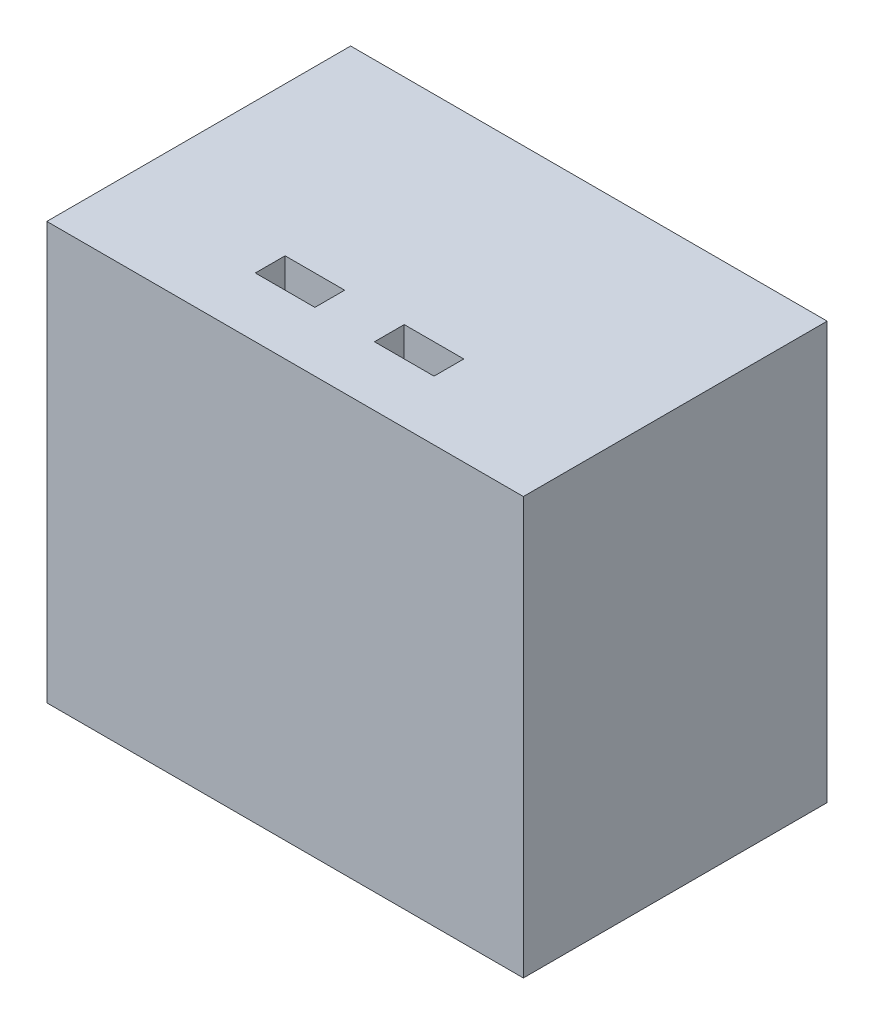
ISO-10303-21;
HEADER;
FILE_DESCRIPTION(('STEP AP214'),'2;1');
FILE_NAME('part.step','',(''),(''),'','','');
FILE_SCHEMA(('AUTOMOTIVE_DESIGN { 1 0 10303 214 1 1 1 1 }'));
ENDSEC;
DATA;
#1=APPLICATION_CONTEXT('core data for automotive mechanical design processes');
#2=APPLICATION_PROTOCOL_DEFINITION('international standard','automotive_design',2000,#1);
#3=PRODUCT_CONTEXT('',#1,'mechanical');
#4=PRODUCT('Part','Part','',(#3));
#5=PRODUCT_RELATED_PRODUCT_CATEGORY('part','',(#4));
#6=PRODUCT_DEFINITION_FORMATION('','',#4);
#7=PRODUCT_DEFINITION_CONTEXT('part definition',#1,'design');
#8=PRODUCT_DEFINITION('design','',#6,#7);
#9=PRODUCT_DEFINITION_SHAPE('','',#8);
#10=(LENGTH_UNIT() NAMED_UNIT(*) SI_UNIT(.MILLI.,.METRE.));
#11=(NAMED_UNIT(*) PLANE_ANGLE_UNIT() SI_UNIT($,.RADIAN.));
#12=(NAMED_UNIT(*) SI_UNIT($,.STERADIAN.) SOLID_ANGLE_UNIT());
#13=UNCERTAINTY_MEASURE_WITH_UNIT(LENGTH_MEASURE(1.E-05),#10,'distance_accuracy_value','');
#14=(GEOMETRIC_REPRESENTATION_CONTEXT(3) GLOBAL_UNCERTAINTY_ASSIGNED_CONTEXT((#13)) GLOBAL_UNIT_ASSIGNED_CONTEXT((#10,
#11,#12)) REPRESENTATION_CONTEXT('',''));
#15=CARTESIAN_POINT('',(0.,0.,0.));
#16=DIRECTION('',(0.,0.,1.));
#17=DIRECTION('',(1.,0.,0.));
#18=AXIS2_PLACEMENT_3D('',#15,#16,#17);
#19=CARTESIAN_POINT('',(40.,-35.,51.));
#20=DIRECTION('',(-1.,0.,0.));
#21=DIRECTION('',(0.,0.,1.));
#22=AXIS2_PLACEMENT_3D('',#19,#20,#21);
#23=PLANE('',#22);
#24=DIRECTION('',(0.,1.,0.));
#25=VECTOR('',#24,1.);
#26=CARTESIAN_POINT('',(40.,-35.,0.));
#27=LINE('',#26,#25);
#28=CARTESIAN_POINT('',(40.,-35.,0.));
#29=VERTEX_POINT('',#28);
#30=CARTESIAN_POINT('',(40.,35.,0.));
#31=VERTEX_POINT('',#30);
#32=EDGE_CURVE('E176',#29,#31,#27,.T.);
#33=ORIENTED_EDGE('',*,*,#32,.T.);
#34=DIRECTION('',(0.,0.,-1.));
#35=VECTOR('',#34,1.);
#36=CARTESIAN_POINT('',(40.,35.,51.));
#37=LINE('',#36,#35);
#38=CARTESIAN_POINT('',(40.,35.,51.));
#39=VERTEX_POINT('',#38);
#40=EDGE_CURVE('E11',#39,#31,#37,.T.);
#41=ORIENTED_EDGE('',*,*,#40,.F.);
#42=DIRECTION('',(0.,1.,0.));
#43=VECTOR('',#42,1.);
#44=CARTESIAN_POINT('',(40.,-35.,51.));
#45=LINE('',#44,#43);
#46=CARTESIAN_POINT('',(40.,-35.,51.));
#47=VERTEX_POINT('',#46);
#48=EDGE_CURVE('E224',#47,#39,#45,.T.);
#49=ORIENTED_EDGE('',*,*,#48,.F.);
#50=DIRECTION('',(0.,0.,-1.));
#51=VECTOR('',#50,1.);
#52=CARTESIAN_POINT('',(40.,-35.,51.));
#53=LINE('',#52,#51);
#54=EDGE_CURVE('E238',#47,#29,#53,.T.);
#55=ORIENTED_EDGE('',*,*,#54,.T.);
#56=EDGE_LOOP('',(#33,#41,#49,#55));
#57=FACE_BOUND('',#56,.T.);
#58=ADVANCED_FACE('F42',(#57),#23,.F.);
#59=CARTESIAN_POINT('',(-40.,35.,51.));
#60=DIRECTION('',(0.,-1.,0.));
#61=DIRECTION('',(0.,0.,-1.));
#62=AXIS2_PLACEMENT_3D('',#59,#60,#61);
#63=PLANE('',#62);
#64=DIRECTION('',(-1.,0.,0.));
#65=VECTOR('',#64,1.);
#66=CARTESIAN_POINT('',(-15.,35.,36.));
#67=LINE('',#66,#65);
#68=CARTESIAN_POINT('',(-5.00000000000001,35.,36.));
#69=VERTEX_POINT('',#68);
#70=CARTESIAN_POINT('',(-15.,35.,36.));
#71=VERTEX_POINT('',#70);
#72=EDGE_CURVE('E167',#69,#71,#67,.T.);
#73=ORIENTED_EDGE('',*,*,#72,.F.);
#74=DIRECTION('',(0.,0.,-1.));
#75=VECTOR('',#74,1.);
#76=CARTESIAN_POINT('',(-5.00000000000001,35.,41.));
#77=LINE('',#76,#75);
#78=CARTESIAN_POINT('',(-5.00000000000001,35.,41.));
#79=VERTEX_POINT('',#78);
#80=EDGE_CURVE('E57',#79,#69,#77,.T.);
#81=ORIENTED_EDGE('',*,*,#80,.F.);
#82=DIRECTION('',(1.,0.,0.));
#83=VECTOR('',#82,1.);
#84=CARTESIAN_POINT('',(-15.,35.,41.));
#85=LINE('',#84,#83);
#86=CARTESIAN_POINT('',(-15.,35.,41.));
#87=VERTEX_POINT('',#86);
#88=EDGE_CURVE('E154',#87,#79,#85,.T.);
#89=ORIENTED_EDGE('',*,*,#88,.F.);
#90=DIRECTION('',(0.,0.,1.));
#91=VECTOR('',#90,1.);
#92=CARTESIAN_POINT('',(-15.,35.,41.));
#93=LINE('',#92,#91);
#94=EDGE_CURVE('E158',#71,#87,#93,.T.);
#95=ORIENTED_EDGE('',*,*,#94,.F.);
#96=EDGE_LOOP('',(#73,#81,#89,#95));
#97=FACE_BOUND('',#96,.T.);
#98=DIRECTION('',(-1.,0.,0.));
#99=VECTOR('',#98,1.);
#100=CARTESIAN_POINT('',(15.,35.,36.));
#101=LINE('',#100,#99);
#102=CARTESIAN_POINT('',(15.,35.,36.));
#103=VERTEX_POINT('',#102);
#104=CARTESIAN_POINT('',(5.00000000000002,35.,36.));
#105=VERTEX_POINT('',#104);
#106=EDGE_CURVE('E204',#103,#105,#101,.T.);
#107=ORIENTED_EDGE('',*,*,#106,.F.);
#108=DIRECTION('',(0.,0.,-1.));
#109=VECTOR('',#108,1.);
#110=CARTESIAN_POINT('',(15.,35.,41.));
#111=LINE('',#110,#109);
#112=CARTESIAN_POINT('',(15.,35.,41.));
#113=VERTEX_POINT('',#112);
#114=EDGE_CURVE('E65',#113,#103,#111,.T.);
#115=ORIENTED_EDGE('',*,*,#114,.F.);
#116=DIRECTION('',(1.,0.,0.));
#117=VECTOR('',#116,1.);
#118=CARTESIAN_POINT('',(15.,35.,41.));
#119=LINE('',#118,#117);
#120=CARTESIAN_POINT('',(5.00000000000002,35.,41.));
#121=VERTEX_POINT('',#120);
#122=EDGE_CURVE('E195',#121,#113,#119,.T.);
#123=ORIENTED_EDGE('',*,*,#122,.F.);
#124=DIRECTION('',(0.,0.,1.));
#125=VECTOR('',#124,1.);
#126=CARTESIAN_POINT('',(5.00000000000002,35.,41.));
#127=LINE('',#126,#125);
#128=EDGE_CURVE('E199',#105,#121,#127,.T.);
#129=ORIENTED_EDGE('',*,*,#128,.F.);
#130=EDGE_LOOP('',(#107,#115,#123,#129));
#131=FACE_BOUND('',#130,.T.);
#132=DIRECTION('',(-1.,0.,0.));
#133=VECTOR('',#132,1.);
#134=CARTESIAN_POINT('',(-40.,35.,0.));
#135=LINE('',#134,#133);
#136=CARTESIAN_POINT('',(-40.,35.,0.));
#137=VERTEX_POINT('',#136);
#138=EDGE_CURVE('E242',#31,#137,#135,.T.);
#139=ORIENTED_EDGE('',*,*,#138,.T.);
#140=DIRECTION('',(0.,0.,-1.));
#141=VECTOR('',#140,1.);
#142=CARTESIAN_POINT('',(-40.,35.,51.));
#143=LINE('',#142,#141);
#144=CARTESIAN_POINT('',(-40.,35.,51.));
#145=VERTEX_POINT('',#144);
#146=EDGE_CURVE('E50',#145,#137,#143,.T.);
#147=ORIENTED_EDGE('',*,*,#146,.F.);
#148=DIRECTION('',(-1.,0.,0.));
#149=VECTOR('',#148,1.);
#150=CARTESIAN_POINT('',(-40.,35.,51.));
#151=LINE('',#150,#149);
#152=EDGE_CURVE('E228',#39,#145,#151,.T.);
#153=ORIENTED_EDGE('',*,*,#152,.F.);
#154=ORIENTED_EDGE('',*,*,#40,.T.);
#155=EDGE_LOOP('',(#139,#147,#153,#154));
#156=FACE_BOUND('',#155,.T.);
#157=ADVANCED_FACE('F278',(#97,#131,#156),#63,.F.);
#158=CARTESIAN_POINT('',(-40.,-35.,51.));
#159=DIRECTION('',(1.,0.,0.));
#160=DIRECTION('',(0.,0.,-1.));
#161=AXIS2_PLACEMENT_3D('',#158,#159,#160);
#162=PLANE('',#161);
#163=DIRECTION('',(0.,-1.,0.));
#164=VECTOR('',#163,1.);
#165=CARTESIAN_POINT('',(-40.,-35.,0.));
#166=LINE('',#165,#164);
#167=CARTESIAN_POINT('',(-40.,-35.,0.));
#168=VERTEX_POINT('',#167);
#169=EDGE_CURVE('E245',#137,#168,#166,.T.);
#170=ORIENTED_EDGE('',*,*,#169,.T.);
#171=DIRECTION('',(0.,0.,-1.));
#172=VECTOR('',#171,1.);
#173=CARTESIAN_POINT('',(-40.,-35.,51.));
#174=LINE('',#173,#172);
#175=CARTESIAN_POINT('',(-40.,-35.,51.));
#176=VERTEX_POINT('',#175);
#177=EDGE_CURVE('E253',#176,#168,#174,.T.);
#178=ORIENTED_EDGE('',*,*,#177,.F.);
#179=DIRECTION('',(0.,-1.,0.));
#180=VECTOR('',#179,1.);
#181=CARTESIAN_POINT('',(-40.,-35.,51.));
#182=LINE('',#181,#180);
#183=EDGE_CURVE('E232',#145,#176,#182,.T.);
#184=ORIENTED_EDGE('',*,*,#183,.F.);
#185=ORIENTED_EDGE('',*,*,#146,.T.);
#186=EDGE_LOOP('',(#170,#178,#184,#185));
#187=FACE_BOUND('',#186,.T.);
#188=ADVANCED_FACE('F262',(#187),#162,.F.);
#189=CARTESIAN_POINT('',(-40.,-35.,51.));
#190=DIRECTION('',(0.,1.,0.));
#191=DIRECTION('',(0.,0.,1.));
#192=AXIS2_PLACEMENT_3D('',#189,#190,#191);
#193=PLANE('',#192);
#194=DIRECTION('',(1.,0.,0.));
#195=VECTOR('',#194,1.);
#196=CARTESIAN_POINT('',(-40.,-35.,0.));
#197=LINE('',#196,#195);
#198=EDGE_CURVE('E229',#168,#29,#197,.T.);
#199=ORIENTED_EDGE('',*,*,#198,.T.);
#200=ORIENTED_EDGE('',*,*,#54,.F.);
#201=DIRECTION('',(1.,0.,0.));
#202=VECTOR('',#201,1.);
#203=CARTESIAN_POINT('',(-40.,-35.,51.));
#204=LINE('',#203,#202);
#205=EDGE_CURVE('E235',#176,#47,#204,.T.);
#206=ORIENTED_EDGE('',*,*,#205,.F.);
#207=ORIENTED_EDGE('',*,*,#177,.T.);
#208=EDGE_LOOP('',(#199,#200,#206,#207));
#209=FACE_BOUND('',#208,.T.);
#210=ADVANCED_FACE('F271',(#209),#193,.F.);
#211=CARTESIAN_POINT('',(0.,0.,51.));
#212=DIRECTION('',(0.,0.,-1.));
#213=DIRECTION('',(-1.,0.,0.));
#214=AXIS2_PLACEMENT_3D('',#211,#212,#213);
#215=PLANE('',#214);
#216=ORIENTED_EDGE('',*,*,#48,.T.);
#217=ORIENTED_EDGE('',*,*,#152,.T.);
#218=ORIENTED_EDGE('',*,*,#183,.T.);
#219=ORIENTED_EDGE('',*,*,#205,.T.);
#220=EDGE_LOOP('',(#216,#217,#218,#219));
#221=FACE_BOUND('',#220,.T.);
#222=ADVANCED_FACE('F277',(#221),#215,.F.);
#223=CARTESIAN_POINT('',(0.,0.,0.));
#224=DIRECTION('',(0.,0.,-1.));
#225=DIRECTION('',(-1.,0.,0.));
#226=AXIS2_PLACEMENT_3D('',#223,#224,#225);
#227=PLANE('',#226);
#228=ORIENTED_EDGE('',*,*,#32,.F.);
#229=ORIENTED_EDGE('',*,*,#198,.F.);
#230=ORIENTED_EDGE('',*,*,#169,.F.);
#231=ORIENTED_EDGE('',*,*,#138,.F.);
#232=EDGE_LOOP('',(#228,#229,#230,#231));
#233=FACE_BOUND('',#232,.T.);
#234=ADVANCED_FACE('F268',(#233),#227,.T.);
#235=CARTESIAN_POINT('',(15.,25.,41.));
#236=DIRECTION('',(1.,0.,0.));
#237=DIRECTION('',(0.,0.,-1.));
#238=AXIS2_PLACEMENT_3D('',#235,#236,#237);
#239=PLANE('',#238);
#240=ORIENTED_EDGE('',*,*,#114,.T.);
#241=DIRECTION('',(0.,1.,0.));
#242=VECTOR('',#241,1.);
#243=CARTESIAN_POINT('',(15.,25.,36.));
#244=LINE('',#243,#242);
#245=CARTESIAN_POINT('',(15.,25.,36.));
#246=VERTEX_POINT('',#245);
#247=EDGE_CURVE('E182',#246,#103,#244,.T.);
#248=ORIENTED_EDGE('',*,*,#247,.F.);
#249=DIRECTION('',(0.,0.,-1.));
#250=VECTOR('',#249,1.);
#251=CARTESIAN_POINT('',(15.,25.,41.));
#252=LINE('',#251,#250);
#253=CARTESIAN_POINT('',(15.,25.,41.));
#254=VERTEX_POINT('',#253);
#255=EDGE_CURVE('E200',#254,#246,#252,.T.);
#256=ORIENTED_EDGE('',*,*,#255,.F.);
#257=DIRECTION('',(0.,1.,0.));
#258=VECTOR('',#257,1.);
#259=CARTESIAN_POINT('',(15.,25.,41.));
#260=LINE('',#259,#258);
#261=EDGE_CURVE('E192',#254,#113,#260,.T.);
#262=ORIENTED_EDGE('',*,*,#261,.T.);
#263=EDGE_LOOP('',(#240,#248,#256,#262));
#264=FACE_BOUND('',#263,.T.);
#265=ADVANCED_FACE('F294',(#264),#239,.F.);
#266=CARTESIAN_POINT('',(15.,25.,41.));
#267=DIRECTION('',(0.,0.,1.));
#268=DIRECTION('',(1.,0.,0.));
#269=AXIS2_PLACEMENT_3D('',#266,#267,#268);
#270=PLANE('',#269);
#271=ORIENTED_EDGE('',*,*,#122,.T.);
#272=ORIENTED_EDGE('',*,*,#261,.F.);
#273=DIRECTION('',(1.,0.,0.));
#274=VECTOR('',#273,1.);
#275=CARTESIAN_POINT('',(15.,25.,41.));
#276=LINE('',#275,#274);
#277=CARTESIAN_POINT('',(5.00000000000002,25.,41.));
#278=VERTEX_POINT('',#277);
#279=EDGE_CURVE('E185',#278,#254,#276,.T.);
#280=ORIENTED_EDGE('',*,*,#279,.F.);
#281=DIRECTION('',(0.,1.,0.));
#282=VECTOR('',#281,1.);
#283=CARTESIAN_POINT('',(5.00000000000002,25.,41.));
#284=LINE('',#283,#282);
#285=EDGE_CURVE('E189',#278,#121,#284,.T.);
#286=ORIENTED_EDGE('',*,*,#285,.T.);
#287=EDGE_LOOP('',(#271,#272,#280,#286));
#288=FACE_BOUND('',#287,.T.);
#289=ADVANCED_FACE('F302',(#288),#270,.F.);
#290=CARTESIAN_POINT('',(5.00000000000002,25.,41.));
#291=DIRECTION('',(-1.,0.,0.));
#292=DIRECTION('',(0.,0.,1.));
#293=AXIS2_PLACEMENT_3D('',#290,#291,#292);
#294=PLANE('',#293);
#295=ORIENTED_EDGE('',*,*,#128,.T.);
#296=ORIENTED_EDGE('',*,*,#285,.F.);
#297=DIRECTION('',(0.,0.,1.));
#298=VECTOR('',#297,1.);
#299=CARTESIAN_POINT('',(5.00000000000002,25.,41.));
#300=LINE('',#299,#298);
#301=CARTESIAN_POINT('',(5.00000000000002,25.,36.));
#302=VERTEX_POINT('',#301);
#303=EDGE_CURVE('E213',#302,#278,#300,.T.);
#304=ORIENTED_EDGE('',*,*,#303,.F.);
#305=DIRECTION('',(0.,1.,0.));
#306=VECTOR('',#305,1.);
#307=CARTESIAN_POINT('',(5.00000000000002,25.,36.));
#308=LINE('',#307,#306);
#309=EDGE_CURVE('E186',#302,#105,#308,.T.);
#310=ORIENTED_EDGE('',*,*,#309,.T.);
#311=EDGE_LOOP('',(#295,#296,#304,#310));
#312=FACE_BOUND('',#311,.T.);
#313=ADVANCED_FACE('F305',(#312),#294,.F.);
#314=CARTESIAN_POINT('',(15.,25.,36.));
#315=DIRECTION('',(0.,0.,-1.));
#316=DIRECTION('',(-1.,0.,0.));
#317=AXIS2_PLACEMENT_3D('',#314,#315,#316);
#318=PLANE('',#317);
#319=ORIENTED_EDGE('',*,*,#106,.T.);
#320=ORIENTED_EDGE('',*,*,#309,.F.);
#321=DIRECTION('',(-1.,0.,0.));
#322=VECTOR('',#321,1.);
#323=CARTESIAN_POINT('',(15.,25.,36.));
#324=LINE('',#323,#322);
#325=EDGE_CURVE('E217',#246,#302,#324,.T.);
#326=ORIENTED_EDGE('',*,*,#325,.F.);
#327=ORIENTED_EDGE('',*,*,#247,.T.);
#328=EDGE_LOOP('',(#319,#320,#326,#327));
#329=FACE_BOUND('',#328,.T.);
#330=ADVANCED_FACE('F300',(#329),#318,.F.);
#331=CARTESIAN_POINT('',(0.,25.,0.));
#332=DIRECTION('',(0.,1.,0.));
#333=DIRECTION('',(0.,0.,1.));
#334=AXIS2_PLACEMENT_3D('',#331,#332,#333);
#335=PLANE('',#334);
#336=ORIENTED_EDGE('',*,*,#255,.T.);
#337=ORIENTED_EDGE('',*,*,#325,.T.);
#338=ORIENTED_EDGE('',*,*,#303,.T.);
#339=ORIENTED_EDGE('',*,*,#279,.T.);
#340=EDGE_LOOP('',(#336,#337,#338,#339));
#341=FACE_BOUND('',#340,.T.);
#342=ADVANCED_FACE('F297',(#341),#335,.T.);
#343=CARTESIAN_POINT('',(-5.00000000000001,25.,41.));
#344=DIRECTION('',(1.,0.,0.));
#345=DIRECTION('',(0.,0.,-1.));
#346=AXIS2_PLACEMENT_3D('',#343,#344,#345);
#347=PLANE('',#346);
#348=ORIENTED_EDGE('',*,*,#80,.T.);
#349=DIRECTION('',(0.,1.,0.));
#350=VECTOR('',#349,1.);
#351=CARTESIAN_POINT('',(-5.00000000000001,25.,36.));
#352=LINE('',#351,#350);
#353=CARTESIAN_POINT('',(-5.00000000000001,25.,36.));
#354=VERTEX_POINT('',#353);
#355=EDGE_CURVE('E129',#354,#69,#352,.T.);
#356=ORIENTED_EDGE('',*,*,#355,.F.);
#357=DIRECTION('',(0.,0.,-1.));
#358=VECTOR('',#357,1.);
#359=CARTESIAN_POINT('',(-5.00000000000001,25.,41.));
#360=LINE('',#359,#358);
#361=CARTESIAN_POINT('',(-5.00000000000001,25.,41.));
#362=VERTEX_POINT('',#361);
#363=EDGE_CURVE('E133',#362,#354,#360,.T.);
#364=ORIENTED_EDGE('',*,*,#363,.F.);
#365=DIRECTION('',(0.,1.,0.));
#366=VECTOR('',#365,1.);
#367=CARTESIAN_POINT('',(-5.00000000000001,25.,41.));
#368=LINE('',#367,#366);
#369=EDGE_CURVE('E173',#362,#79,#368,.T.);
#370=ORIENTED_EDGE('',*,*,#369,.T.);
#371=EDGE_LOOP('',(#348,#356,#364,#370));
#372=FACE_BOUND('',#371,.T.);
#373=ADVANCED_FACE('F131',(#372),#347,.F.);
#374=CARTESIAN_POINT('',(-15.,25.,41.));
#375=DIRECTION('',(0.,0.,1.));
#376=DIRECTION('',(1.,0.,0.));
#377=AXIS2_PLACEMENT_3D('',#374,#375,#376);
#378=PLANE('',#377);
#379=ORIENTED_EDGE('',*,*,#88,.T.);
#380=ORIENTED_EDGE('',*,*,#369,.F.);
#381=DIRECTION('',(1.,0.,0.));
#382=VECTOR('',#381,1.);
#383=CARTESIAN_POINT('',(-15.,25.,41.));
#384=LINE('',#383,#382);
#385=CARTESIAN_POINT('',(-15.,25.,41.));
#386=VERTEX_POINT('',#385);
#387=EDGE_CURVE('E140',#386,#362,#384,.T.);
#388=ORIENTED_EDGE('',*,*,#387,.F.);
#389=DIRECTION('',(0.,1.,0.));
#390=VECTOR('',#389,1.);
#391=CARTESIAN_POINT('',(-15.,25.,41.));
#392=LINE('',#391,#390);
#393=EDGE_CURVE('E177',#386,#87,#392,.T.);
#394=ORIENTED_EDGE('',*,*,#393,.T.);
#395=EDGE_LOOP('',(#379,#380,#388,#394));
#396=FACE_BOUND('',#395,.T.);
#397=ADVANCED_FACE('F317',(#396),#378,.F.);
#398=CARTESIAN_POINT('',(-15.,25.,41.));
#399=DIRECTION('',(-1.,0.,0.));
#400=DIRECTION('',(0.,0.,1.));
#401=AXIS2_PLACEMENT_3D('',#398,#399,#400);
#402=PLANE('',#401);
#403=ORIENTED_EDGE('',*,*,#94,.T.);
#404=ORIENTED_EDGE('',*,*,#393,.F.);
#405=DIRECTION('',(0.,0.,1.));
#406=VECTOR('',#405,1.);
#407=CARTESIAN_POINT('',(-15.,25.,41.));
#408=LINE('',#407,#406);
#409=CARTESIAN_POINT('',(-15.,25.,36.));
#410=VERTEX_POINT('',#409);
#411=EDGE_CURVE('E149',#410,#386,#408,.T.);
#412=ORIENTED_EDGE('',*,*,#411,.F.);
#413=DIRECTION('',(0.,1.,0.));
#414=VECTOR('',#413,1.);
#415=CARTESIAN_POINT('',(-15.,25.,36.));
#416=LINE('',#415,#414);
#417=EDGE_CURVE('E139',#410,#71,#416,.T.);
#418=ORIENTED_EDGE('',*,*,#417,.T.);
#419=EDGE_LOOP('',(#403,#404,#412,#418));
#420=FACE_BOUND('',#419,.T.);
#421=ADVANCED_FACE('F320',(#420),#402,.F.);
#422=CARTESIAN_POINT('',(-15.,25.,36.));
#423=DIRECTION('',(0.,0.,-1.));
#424=DIRECTION('',(-1.,0.,0.));
#425=AXIS2_PLACEMENT_3D('',#422,#423,#424);
#426=PLANE('',#425);
#427=ORIENTED_EDGE('',*,*,#72,.T.);
#428=ORIENTED_EDGE('',*,*,#417,.F.);
#429=DIRECTION('',(-1.,0.,0.));
#430=VECTOR('',#429,1.);
#431=CARTESIAN_POINT('',(-15.,25.,36.));
#432=LINE('',#431,#430);
#433=EDGE_CURVE('E143',#354,#410,#432,.T.);
#434=ORIENTED_EDGE('',*,*,#433,.F.);
#435=ORIENTED_EDGE('',*,*,#355,.T.);
#436=EDGE_LOOP('',(#427,#428,#434,#435));
#437=FACE_BOUND('',#436,.T.);
#438=ADVANCED_FACE('F144',(#437),#426,.F.);
#439=CARTESIAN_POINT('',(0.,25.,0.));
#440=DIRECTION('',(0.,-1.,0.));
#441=DIRECTION('',(0.,0.,-1.));
#442=AXIS2_PLACEMENT_3D('',#439,#440,#441);
#443=PLANE('',#442);
#444=ORIENTED_EDGE('',*,*,#363,.T.);
#445=ORIENTED_EDGE('',*,*,#433,.T.);
#446=ORIENTED_EDGE('',*,*,#411,.T.);
#447=ORIENTED_EDGE('',*,*,#387,.T.);
#448=EDGE_LOOP('',(#444,#445,#446,#447));
#449=FACE_BOUND('',#448,.T.);
#450=ADVANCED_FACE('F151',(#449),#443,.F.);
#451=CLOSED_SHELL('',(#58,#157,#188,#210,#222,#234,#265,#289,#313,#330,#342,#373,#397,#421,#438,#450));
#452=MANIFOLD_SOLID_BREP('B2',#451);
#453=ADVANCED_BREP_SHAPE_REPRESENTATION('',(#18,#452),#14);
#454=SHAPE_DEFINITION_REPRESENTATION(#9,#453);
ENDSEC;
END-ISO-10303-21;
